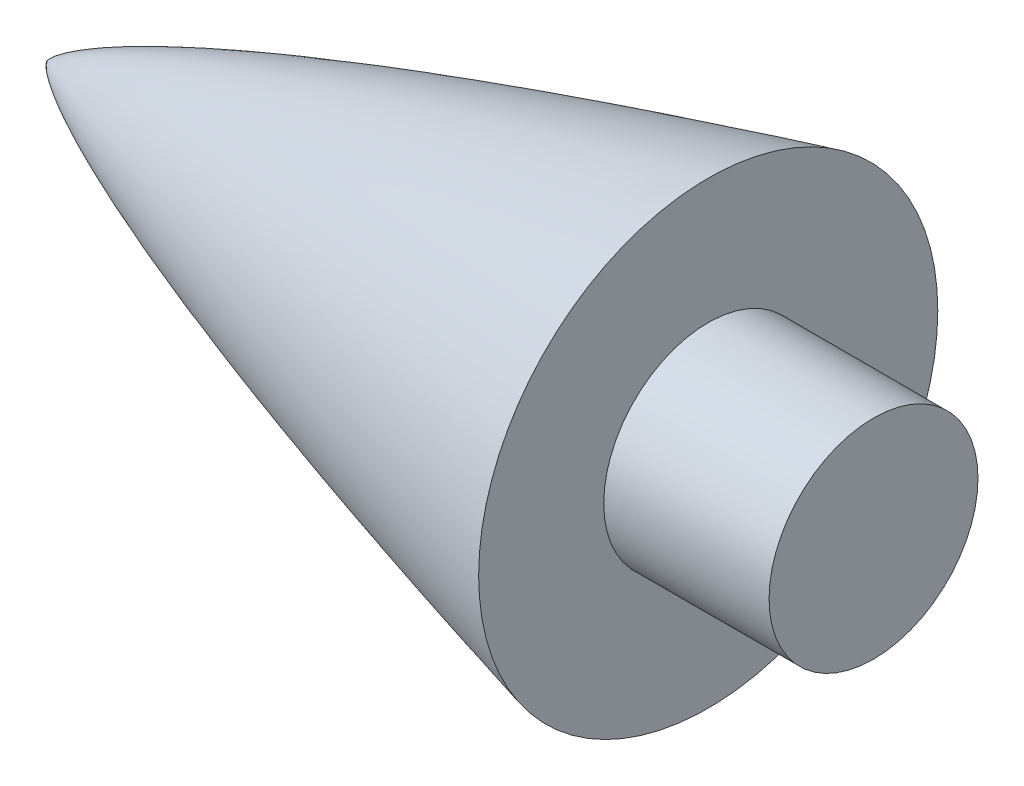
ISO-10303-21;
HEADER;
FILE_DESCRIPTION(('STEP AP214'),'2;1');
FILE_NAME('part.step','',(''),(''),'','','');
FILE_SCHEMA(('AUTOMOTIVE_DESIGN { 1 0 10303 214 1 1 1 1 }'));
ENDSEC;
DATA;
#1=APPLICATION_CONTEXT('core data for automotive mechanical design processes');
#2=APPLICATION_PROTOCOL_DEFINITION('international standard','automotive_design',2000,#1);
#3=PRODUCT_CONTEXT('',#1,'mechanical');
#4=PRODUCT('Part','Part','',(#3));
#5=PRODUCT_RELATED_PRODUCT_CATEGORY('part','',(#4));
#6=PRODUCT_DEFINITION_FORMATION('','',#4);
#7=PRODUCT_DEFINITION_CONTEXT('part definition',#1,'design');
#8=PRODUCT_DEFINITION('design','',#6,#7);
#9=PRODUCT_DEFINITION_SHAPE('','',#8);
#10=(LENGTH_UNIT() NAMED_UNIT(*) SI_UNIT(.MILLI.,.METRE.));
#11=(NAMED_UNIT(*) PLANE_ANGLE_UNIT() SI_UNIT($,.RADIAN.));
#12=(NAMED_UNIT(*) SI_UNIT($,.STERADIAN.) SOLID_ANGLE_UNIT());
#13=UNCERTAINTY_MEASURE_WITH_UNIT(LENGTH_MEASURE(1.E-05),#10,'distance_accuracy_value','');
#14=(GEOMETRIC_REPRESENTATION_CONTEXT(3) GLOBAL_UNCERTAINTY_ASSIGNED_CONTEXT((#13)) GLOBAL_UNIT_ASSIGNED_CONTEXT((#10,
#11,#12)) REPRESENTATION_CONTEXT('',''));
#15=CARTESIAN_POINT('',(0.,0.,0.));
#16=DIRECTION('',(0.,0.,1.));
#17=DIRECTION('',(1.,0.,0.));
#18=AXIS2_PLACEMENT_3D('',#15,#16,#17);
#19=CARTESIAN_POINT('',(700.,0.,-92.));
#20=CARTESIAN_POINT('',(697.868499326586,0.,-91.99333535286));
#21=CARTESIAN_POINT('',(693.605741333596,0.,-91.9417021232189));
#22=CARTESIAN_POINT('',(685.081182636595,0.,-91.7804112114376));
#23=CARTESIAN_POINT('',(671.057263834675,0.,-91.3807195635262));
#24=CARTESIAN_POINT('',(653.668023826953,0.,-90.7264173364497));
#25=CARTESIAN_POINT('',(627.419605801014,0.,-89.5028555150498));
#26=CARTESIAN_POINT('',(594.452384000242,0.,-87.6183552688963));
#27=CARTESIAN_POINT('',(556.016196354304,0.,-85.0096035853564));
#28=CARTESIAN_POINT('',(512.124428867261,0.,-81.5496463256174));
#29=CARTESIAN_POINT('',(468.26894402085,0.,-77.6580750936227));
#30=CARTESIAN_POINT('',(424.45146038967,0.,-73.3601463015601));
#31=CARTESIAN_POINT('',(380.674593437464,0.,-68.6667475341556));
#32=CARTESIAN_POINT('',(336.942021596438,0.,-63.5768420567035));
#33=CARTESIAN_POINT('',(293.258988419395,0.,-58.077611770231));
#34=CARTESIAN_POINT('',(249.632824355057,0.,-52.1430593136281));
#35=CARTESIAN_POINT('',(206.074460710529,0.,-45.7286090635298));
#36=CARTESIAN_POINT('',(162.600367904842,0.,-38.7630779477786));
#37=CARTESIAN_POINT('',(124.65879635959,0.,-32.0802121269647));
#38=CARTESIAN_POINT('',(92.2395951945772,0.,-25.797411611516));
#39=CARTESIAN_POINT('',(65.219754514563,0.,-20.0193073732391));
#40=CARTESIAN_POINT('',(45.3573118169806,0.,-15.3594691672867));
#41=CARTESIAN_POINT('',(28.9174255121491,0.,-11.0394105233675));
#42=CARTESIAN_POINT('',(16.8107271004778,0.,-7.37733085899251));
#43=CARTESIAN_POINT('',(9.55143107204411,0.,-4.83077820444099));
#44=CARTESIAN_POINT('',(5.55936202239758,0.,-3.2176058741144));
#45=CARTESIAN_POINT('',(3.3528446811443,0.,-2.20038034027408));
#46=CARTESIAN_POINT('',(2.08766516076463,0.,-1.540864262922));
#47=CARTESIAN_POINT('',(1.38151687078439,0.,-1.12829099523136));
#48=CARTESIAN_POINT('',(0.978240009633528,0.,-0.869271861421812));
#49=CARTESIAN_POINT('',(0.682008296008043,0.,-0.663619162775487));
#50=CARTESIAN_POINT('',(0.489821470623465,0.,-0.519272356202533));
#51=CARTESIAN_POINT('',(0.321314167593637,0.,-0.380305786106172));
#52=CARTESIAN_POINT('',(0.179361524290631,0.,-0.244890293422292));
#53=CARTESIAN_POINT('',(0.106292542967214,0.,-0.166564671929767));
#54=CARTESIAN_POINT('',(0.0537123122747423,0.,-0.100813891340451));
#55=CARTESIAN_POINT('',(0.0203199108483335,0.,-0.0494052719775881));
#56=CARTESIAN_POINT('',(0.00668277132067271,0.,-0.0219756665793665));
#57=CARTESIAN_POINT('',(0.00191147016778152,0.,-0.00745245466355674));
#58=CARTESIAN_POINT('',(0.,0.,0.));
#59=B_SPLINE_CURVE_WITH_KNOTS('',4,(#19,#20,#21,#22,#23,#24,#25,#26,#27,#28,#29,#30,#31,#32,#33,
#34,#35,#36,#37,#38,#39,#40,#41,#42,#43,#44,#45,#46,#47,#48,#49,#50,#51,#52,#53,#54,#55,#56,#57,
#58),.UNSPECIFIED.,.F.,.F.,(5,1,1,1,1,1,1,1,1,1,1,1,1,1,1,1,1,1,1,1,1,1,1,1,1,1,1,1,1,1,1,1,1,1,
1,1,5),(0.,0.0120407218477001,0.0240814436954003,0.0481628873908007,0.0792512426399038,
0.110339597889007,0.172516307667353,0.234693017121355,0.296869727510222,0.359046436827135,
0.421223146426248,0.483399857970342,0.545576565949616,0.607753274854056,0.669929984051467,
0.732106692841874,0.794283401199507,0.856460116574915,0.887548461360132,0.918636806145348,
0.950360343127856,0.971698660503953,0.983552024574098,0.990067665903079,0.993803587313,
0.996012709509613,0.997272211568348,0.998124303551254,0.99842191397941,0.998719524407566,
0.99930903764263,0.999481778231973,0.999654518821315,0.999827259410658,0.999913629705329,
0.999956814852664,1.),.UNSPECIFIED.);
#60=CARTESIAN_POINT('',(0.,0.,0.));
#61=DIRECTION('',(-1.,0.,0.));
#62=AXIS1_PLACEMENT('',#60,#61);
#63=SURFACE_OF_REVOLUTION('',#59,#62);
#64=CARTESIAN_POINT('',(0.,0.,0.));
#65=VERTEX_POINT('',#64);
#66=VERTEX_LOOP('',#65);
#67=FACE_BOUND('',#66,.T.);
#68=CARTESIAN_POINT('',(40.,0.,0.));
#69=DIRECTION('',(-1.,0.,0.));
#70=DIRECTION('',(0.,0.,1.));
#71=AXIS2_PLACEMENT_3D('',#68,#69,#70);
#72=CIRCLE('',#71,13.8881332476044);
#73=CARTESIAN_POINT('',(40.,0.,13.8881332476044));
#74=VERTEX_POINT('',#73);
#75=EDGE_CURVE('E52',#74,#74,#72,.T.);
#76=ORIENTED_EDGE('',*,*,#75,.T.);
#77=EDGE_LOOP('',(#76));
#78=FACE_BOUND('',#77,.T.);
#79=ADVANCED_FACE('F45',(#67,#78),#63,.T.);
#80=CARTESIAN_POINT('',(40.,0.,0.));
#81=DIRECTION('',(-1.,0.,0.));
#82=DIRECTION('',(0.,0.,1.));
#83=AXIS2_PLACEMENT_3D('',#80,#81,#82);
#84=PLANE('',#83);
#85=CARTESIAN_POINT('',(40.,0.,0.));
#86=DIRECTION('',(-1.,0.,0.));
#87=DIRECTION('',(0.,0.,1.));
#88=AXIS2_PLACEMENT_3D('',#85,#86,#87);
#89=CIRCLE('',#88,6.32);
#90=CARTESIAN_POINT('',(40.,0.,6.32));
#91=VERTEX_POINT('',#90);
#92=EDGE_CURVE('E11',#91,#91,#89,.F.);
#93=ORIENTED_EDGE('',*,*,#92,.F.);
#94=EDGE_LOOP('',(#93));
#95=FACE_BOUND('',#94,.T.);
#96=ORIENTED_EDGE('',*,*,#75,.F.);
#97=EDGE_LOOP('',(#96));
#98=FACE_BOUND('',#97,.T.);
#99=ADVANCED_FACE('F47',(#95,#98),#84,.F.);
#100=CARTESIAN_POINT('',(50.,0.,0.));
#101=DIRECTION('',(-1.,0.,0.));
#102=DIRECTION('',(0.,0.,1.));
#103=AXIS2_PLACEMENT_3D('',#100,#101,#102);
#104=CYLINDRICAL_SURFACE('',#103,6.32);
#105=CARTESIAN_POINT('',(50.,0.,0.));
#106=DIRECTION('',(1.,0.,0.));
#107=DIRECTION('',(0.,0.,-1.));
#108=AXIS2_PLACEMENT_3D('',#105,#106,#107);
#109=CIRCLE('',#108,6.32);
#110=CARTESIAN_POINT('',(50.,0.,-6.32));
#111=VERTEX_POINT('',#110);
#112=EDGE_CURVE('E60',#111,#111,#109,.T.);
#113=ORIENTED_EDGE('',*,*,#112,.F.);
#114=EDGE_LOOP('',(#113));
#115=FACE_BOUND('',#114,.T.);
#116=ORIENTED_EDGE('',*,*,#92,.T.);
#117=EDGE_LOOP('',(#116));
#118=FACE_BOUND('',#117,.T.);
#119=ADVANCED_FACE('F71',(#115,#118),#104,.T.);
#120=CARTESIAN_POINT('',(50.,0.,0.));
#121=DIRECTION('',(1.,0.,0.));
#122=DIRECTION('',(0.,0.,-1.));
#123=AXIS2_PLACEMENT_3D('',#120,#121,#122);
#124=PLANE('',#123);
#125=ORIENTED_EDGE('',*,*,#112,.T.);
#126=EDGE_LOOP('',(#125));
#127=FACE_BOUND('',#126,.T.);
#128=ADVANCED_FACE('F74',(#127),#124,.T.);
#129=CLOSED_SHELL('',(#79,#99,#119,#128));
#130=MANIFOLD_SOLID_BREP('B2',#129);
#131=ADVANCED_BREP_SHAPE_REPRESENTATION('',(#18,#130),#14);
#132=SHAPE_DEFINITION_REPRESENTATION(#9,#131);
ENDSEC;
END-ISO-10303-21;
